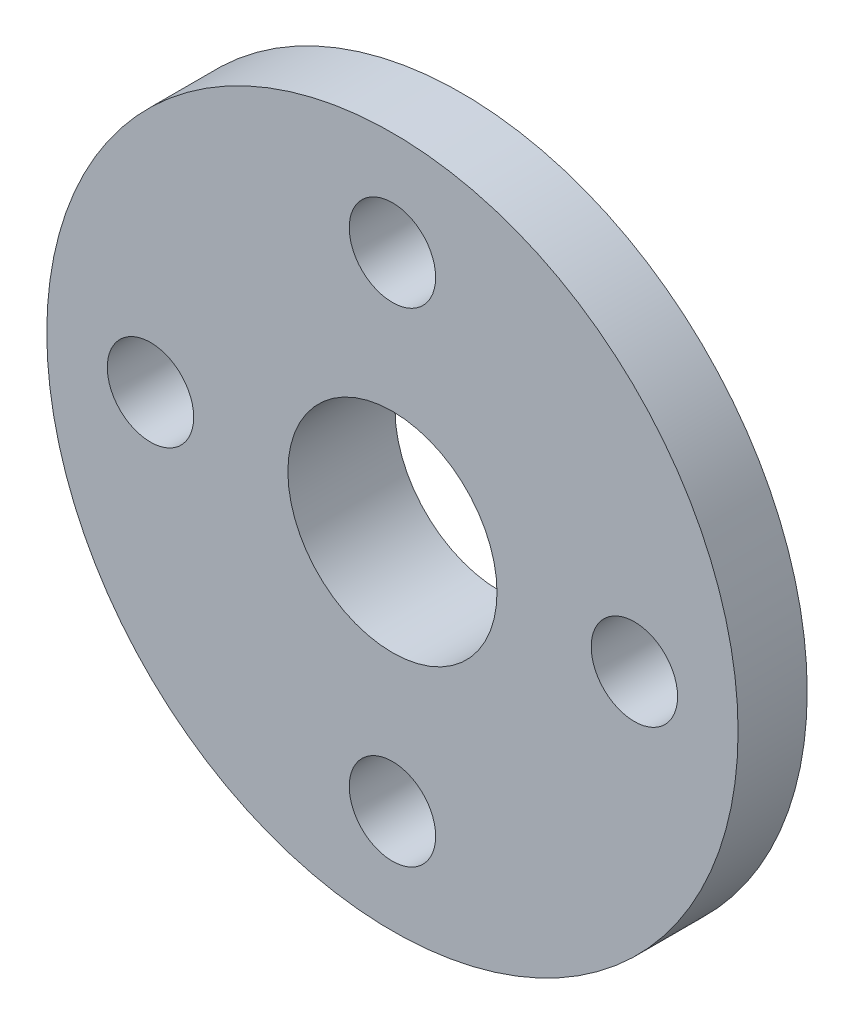
ISO-10303-21;
HEADER;
FILE_DESCRIPTION(('STEP AP214'),'2;1');
FILE_NAME('part.step','',(''),(''),'','','');
FILE_SCHEMA(('AUTOMOTIVE_DESIGN { 1 0 10303 214 1 1 1 1 }'));
ENDSEC;
DATA;
#1=APPLICATION_CONTEXT('core data for automotive mechanical design processes');
#2=APPLICATION_PROTOCOL_DEFINITION('international standard','automotive_design',2000,#1);
#3=PRODUCT_CONTEXT('',#1,'mechanical');
#4=PRODUCT('Part','Part','',(#3));
#5=PRODUCT_RELATED_PRODUCT_CATEGORY('part','',(#4));
#6=PRODUCT_DEFINITION_FORMATION('','',#4);
#7=PRODUCT_DEFINITION_CONTEXT('part definition',#1,'design');
#8=PRODUCT_DEFINITION('design','',#6,#7);
#9=PRODUCT_DEFINITION_SHAPE('','',#8);
#10=(LENGTH_UNIT() NAMED_UNIT(*) SI_UNIT(.MILLI.,.METRE.));
#11=(NAMED_UNIT(*) PLANE_ANGLE_UNIT() SI_UNIT($,.RADIAN.));
#12=(NAMED_UNIT(*) SI_UNIT($,.STERADIAN.) SOLID_ANGLE_UNIT());
#13=UNCERTAINTY_MEASURE_WITH_UNIT(LENGTH_MEASURE(1.E-05),#10,'distance_accuracy_value','');
#14=(GEOMETRIC_REPRESENTATION_CONTEXT(3) GLOBAL_UNCERTAINTY_ASSIGNED_CONTEXT((#13)) GLOBAL_UNIT_ASSIGNED_CONTEXT((#10,
#11,#12)) REPRESENTATION_CONTEXT('',''));
#15=CARTESIAN_POINT('',(0.,0.,0.));
#16=DIRECTION('',(0.,0.,1.));
#17=DIRECTION('',(1.,0.,0.));
#18=AXIS2_PLACEMENT_3D('',#15,#16,#17);
#19=CARTESIAN_POINT('',(-39.10264651977,-19.8999981269,9.476));
#20=DIRECTION('',(0.,0.,1.));
#21=DIRECTION('',(1.,0.,0.));
#22=AXIS2_PLACEMENT_3D('',#19,#20,#21);
#23=CYLINDRICAL_SURFACE('',#22,10.);
#24=CARTESIAN_POINT('',(-39.10264651977,-19.8999981269,9.476));
#25=DIRECTION('',(0.,0.,1.));
#26=DIRECTION('',(1.,0.,0.));
#27=AXIS2_PLACEMENT_3D('',#24,#25,#26);
#28=CIRCLE('',#27,10.);
#29=CARTESIAN_POINT('',(-29.10264651977,-19.8999981269,9.476));
#30=VERTEX_POINT('',#29);
#31=EDGE_CURVE('E36',#30,#30,#28,.T.);
#32=ORIENTED_EDGE('',*,*,#31,.T.);
#33=EDGE_LOOP('',(#32));
#34=FACE_BOUND('',#33,.T.);
#35=CARTESIAN_POINT('',(-39.10264651977,-19.8999981269,11.476));
#36=DIRECTION('',(0.,0.,1.));
#37=DIRECTION('',(1.,0.,0.));
#38=AXIS2_PLACEMENT_3D('',#35,#36,#37);
#39=CIRCLE('',#38,10.);
#40=CARTESIAN_POINT('',(-29.10264651977,-19.8999981269,11.476));
#41=VERTEX_POINT('',#40);
#42=EDGE_CURVE('E46',#41,#41,#39,.T.);
#43=ORIENTED_EDGE('',*,*,#42,.F.);
#44=EDGE_LOOP('',(#43));
#45=FACE_BOUND('',#44,.T.);
#46=ADVANCED_FACE('F34',(#34,#45),#23,.T.);
#47=CARTESIAN_POINT('',(-29.10264651977,-19.8999981269,9.476));
#48=DIRECTION('',(0.,0.,-1.));
#49=DIRECTION('',(-1.,0.,0.));
#50=AXIS2_PLACEMENT_3D('',#47,#48,#49);
#51=PLANE('',#50);
#52=CARTESIAN_POINT('',(-46.10264464667,-19.8999981269,9.476));
#53=DIRECTION('',(0.,0.,-1.));
#54=DIRECTION('',(-1.,0.,0.));
#55=AXIS2_PLACEMENT_3D('',#52,#53,#54);
#56=CIRCLE('',#55,1.24999999999999);
#57=CARTESIAN_POINT('',(-47.35264464667,-19.8999981269,9.476));
#58=VERTEX_POINT('',#57);
#59=EDGE_CURVE('E84',#58,#58,#56,.T.);
#60=ORIENTED_EDGE('',*,*,#59,.F.);
#61=EDGE_LOOP('',(#60));
#62=FACE_BOUND('',#61,.T.);
#63=CARTESIAN_POINT('',(-39.10264651977,-26.8999962538,9.476));
#64=DIRECTION('',(0.,0.,-1.));
#65=DIRECTION('',(-1.,0.,0.));
#66=AXIS2_PLACEMENT_3D('',#63,#64,#65);
#67=CIRCLE('',#66,1.24999999999999);
#68=CARTESIAN_POINT('',(-40.35264651977,-26.8999962538,9.476));
#69=VERTEX_POINT('',#68);
#70=EDGE_CURVE('E76',#69,#69,#67,.T.);
#71=ORIENTED_EDGE('',*,*,#70,.F.);
#72=EDGE_LOOP('',(#71));
#73=FACE_BOUND('',#72,.T.);
#74=CARTESIAN_POINT('',(-32.10264839287,-19.8999981269,9.476));
#75=DIRECTION('',(0.,0.,-1.));
#76=DIRECTION('',(-1.,0.,0.));
#77=AXIS2_PLACEMENT_3D('',#74,#75,#76);
#78=CIRCLE('',#77,1.24999999999999);
#79=CARTESIAN_POINT('',(-33.35264839287,-19.8999981269,9.476));
#80=VERTEX_POINT('',#79);
#81=EDGE_CURVE('E66',#80,#80,#78,.T.);
#82=ORIENTED_EDGE('',*,*,#81,.F.);
#83=EDGE_LOOP('',(#82));
#84=FACE_BOUND('',#83,.T.);
#85=CARTESIAN_POINT('',(-39.10264651977,-12.9,9.476));
#86=DIRECTION('',(0.,0.,-1.));
#87=DIRECTION('',(-1.,0.,0.));
#88=AXIS2_PLACEMENT_3D('',#85,#86,#87);
#89=CIRCLE('',#88,1.24999999999999);
#90=CARTESIAN_POINT('',(-40.35264651977,-12.9,9.476));
#91=VERTEX_POINT('',#90);
#92=EDGE_CURVE('E62',#91,#91,#89,.T.);
#93=ORIENTED_EDGE('',*,*,#92,.F.);
#94=EDGE_LOOP('',(#93));
#95=FACE_BOUND('',#94,.T.);
#96=CARTESIAN_POINT('',(-39.10264651977,-19.8999981269,9.476));
#97=DIRECTION('',(0.,0.,-1.));
#98=DIRECTION('',(-1.,0.,0.));
#99=AXIS2_PLACEMENT_3D('',#96,#97,#98);
#100=CIRCLE('',#99,4.5);
#101=CARTESIAN_POINT('',(-43.60264651977,-19.8999981269,9.476));
#102=VERTEX_POINT('',#101);
#103=EDGE_CURVE('E10',#102,#102,#100,.T.);
#104=ORIENTED_EDGE('',*,*,#103,.F.);
#105=EDGE_LOOP('',(#104));
#106=FACE_BOUND('',#105,.T.);
#107=ORIENTED_EDGE('',*,*,#31,.F.);
#108=EDGE_LOOP('',(#107));
#109=FACE_BOUND('',#108,.T.);
#110=ADVANCED_FACE('F92',(#62,#73,#84,#95,#106,#109),#51,.T.);
#111=CARTESIAN_POINT('',(-39.10264651977,-19.8999981269,11.476));
#112=DIRECTION('',(0.,0.,1.));
#113=DIRECTION('',(1.,0.,0.));
#114=AXIS2_PLACEMENT_3D('',#111,#112,#113);
#115=PLANE('',#114);
#116=CARTESIAN_POINT('',(-46.10264464667,-19.8999981269,11.476));
#117=DIRECTION('',(0.,0.,1.));
#118=DIRECTION('',(1.,0.,0.));
#119=AXIS2_PLACEMENT_3D('',#116,#117,#118);
#120=CIRCLE('',#119,1.24999999999999);
#121=CARTESIAN_POINT('',(-44.85264464667,-19.8999981269,11.476));
#122=VERTEX_POINT('',#121);
#123=EDGE_CURVE('E81',#122,#122,#120,.T.);
#124=ORIENTED_EDGE('',*,*,#123,.F.);
#125=EDGE_LOOP('',(#124));
#126=FACE_BOUND('',#125,.T.);
#127=CARTESIAN_POINT('',(-39.10264651977,-26.8999962538,11.476));
#128=DIRECTION('',(0.,0.,1.));
#129=DIRECTION('',(1.,0.,0.));
#130=AXIS2_PLACEMENT_3D('',#127,#128,#129);
#131=CIRCLE('',#130,1.24999999999999);
#132=CARTESIAN_POINT('',(-37.85264651977,-26.8999962538,11.476));
#133=VERTEX_POINT('',#132);
#134=EDGE_CURVE('E78',#133,#133,#131,.T.);
#135=ORIENTED_EDGE('',*,*,#134,.F.);
#136=EDGE_LOOP('',(#135));
#137=FACE_BOUND('',#136,.T.);
#138=CARTESIAN_POINT('',(-32.10264839287,-19.8999981269,11.476));
#139=DIRECTION('',(0.,0.,1.));
#140=DIRECTION('',(1.,0.,0.));
#141=AXIS2_PLACEMENT_3D('',#138,#139,#140);
#142=CIRCLE('',#141,1.24999999999999);
#143=CARTESIAN_POINT('',(-30.85264839287,-19.8999981269,11.476));
#144=VERTEX_POINT('',#143);
#145=EDGE_CURVE('E71',#144,#144,#142,.T.);
#146=ORIENTED_EDGE('',*,*,#145,.F.);
#147=EDGE_LOOP('',(#146));
#148=FACE_BOUND('',#147,.T.);
#149=CARTESIAN_POINT('',(-39.10264651977,-12.9,11.476));
#150=DIRECTION('',(0.,0.,1.));
#151=DIRECTION('',(1.,0.,0.));
#152=AXIS2_PLACEMENT_3D('',#149,#150,#151);
#153=CIRCLE('',#152,1.24999999999999);
#154=CARTESIAN_POINT('',(-37.85264651977,-12.9,11.476));
#155=VERTEX_POINT('',#154);
#156=EDGE_CURVE('E69',#155,#155,#153,.T.);
#157=ORIENTED_EDGE('',*,*,#156,.F.);
#158=EDGE_LOOP('',(#157));
#159=FACE_BOUND('',#158,.T.);
#160=CARTESIAN_POINT('',(-39.10264651977,-19.8999981269,11.476));
#161=DIRECTION('',(0.,0.,1.));
#162=DIRECTION('',(1.,0.,0.));
#163=AXIS2_PLACEMENT_3D('',#160,#161,#162);
#164=CIRCLE('',#163,3.02500000000001);
#165=CARTESIAN_POINT('',(-36.07764651977,-19.8999981269,11.476));
#166=VERTEX_POINT('',#165);
#167=EDGE_CURVE('E59',#166,#166,#164,.T.);
#168=ORIENTED_EDGE('',*,*,#167,.F.);
#169=EDGE_LOOP('',(#168));
#170=FACE_BOUND('',#169,.T.);
#171=ORIENTED_EDGE('',*,*,#42,.T.);
#172=EDGE_LOOP('',(#171));
#173=FACE_BOUND('',#172,.T.);
#174=ADVANCED_FACE('F93',(#126,#137,#148,#159,#170,#173),#115,.T.);
#175=CARTESIAN_POINT('',(-39.10264651977,-19.8999981269,8.376));
#176=DIRECTION('',(0.,0.,1.));
#177=DIRECTION('',(1.,0.,0.));
#178=AXIS2_PLACEMENT_3D('',#175,#176,#177);
#179=CYLINDRICAL_SURFACE('',#178,4.5);
#180=CARTESIAN_POINT('',(-39.10264651977,-19.8999981269,8.376));
#181=DIRECTION('',(0.,0.,-1.));
#182=DIRECTION('',(-1.,0.,0.));
#183=AXIS2_PLACEMENT_3D('',#180,#181,#182);
#184=CIRCLE('',#183,4.5);
#185=CARTESIAN_POINT('',(-43.60264651977,-19.8999981269,8.376));
#186=VERTEX_POINT('',#185);
#187=EDGE_CURVE('E48',#186,#186,#184,.T.);
#188=ORIENTED_EDGE('',*,*,#187,.F.);
#189=EDGE_LOOP('',(#188));
#190=FACE_BOUND('',#189,.T.);
#191=ORIENTED_EDGE('',*,*,#103,.T.);
#192=EDGE_LOOP('',(#191));
#193=FACE_BOUND('',#192,.T.);
#194=ADVANCED_FACE('F94',(#190,#193),#179,.T.);
#195=CARTESIAN_POINT('',(-39.10264651977,-19.8999981269,8.376));
#196=DIRECTION('',(0.,0.,-1.));
#197=DIRECTION('',(-1.,0.,0.));
#198=AXIS2_PLACEMENT_3D('',#195,#196,#197);
#199=PLANE('',#198);
#200=CARTESIAN_POINT('',(-39.10264651977,-19.8999981269,8.376));
#201=DIRECTION('',(0.,0.,1.));
#202=DIRECTION('',(1.,0.,0.));
#203=AXIS2_PLACEMENT_3D('',#200,#201,#202);
#204=CIRCLE('',#203,3.02500000000001);
#205=CARTESIAN_POINT('',(-36.07764651977,-19.8999981269,8.376));
#206=VERTEX_POINT('',#205);
#207=EDGE_CURVE('E53',#206,#206,#204,.T.);
#208=ORIENTED_EDGE('',*,*,#207,.T.);
#209=EDGE_LOOP('',(#208));
#210=FACE_BOUND('',#209,.T.);
#211=ORIENTED_EDGE('',*,*,#187,.T.);
#212=EDGE_LOOP('',(#211));
#213=FACE_BOUND('',#212,.T.);
#214=ADVANCED_FACE('F107',(#210,#213),#199,.T.);
#215=CARTESIAN_POINT('',(-39.10264651977,-19.8999981269,11.476));
#216=DIRECTION('',(0.,0.,1.));
#217=DIRECTION('',(1.,0.,0.));
#218=AXIS2_PLACEMENT_3D('',#215,#216,#217);
#219=CYLINDRICAL_SURFACE('',#218,3.02500000000001);
#220=ORIENTED_EDGE('',*,*,#207,.F.);
#221=EDGE_LOOP('',(#220));
#222=FACE_BOUND('',#221,.T.);
#223=ORIENTED_EDGE('',*,*,#167,.T.);
#224=EDGE_LOOP('',(#223));
#225=FACE_BOUND('',#224,.T.);
#226=ADVANCED_FACE('F104',(#222,#225),#219,.F.);
#227=CARTESIAN_POINT('',(-39.10264651977,-12.9,11.476));
#228=DIRECTION('',(0.,0.,1.));
#229=DIRECTION('',(1.,0.,0.));
#230=AXIS2_PLACEMENT_3D('',#227,#228,#229);
#231=CYLINDRICAL_SURFACE('',#230,1.24999999999999);
#232=ORIENTED_EDGE('',*,*,#92,.T.);
#233=EDGE_LOOP('',(#232));
#234=FACE_BOUND('',#233,.T.);
#235=ORIENTED_EDGE('',*,*,#156,.T.);
#236=EDGE_LOOP('',(#235));
#237=FACE_BOUND('',#236,.T.);
#238=ADVANCED_FACE('F110',(#234,#237),#231,.F.);
#239=CARTESIAN_POINT('',(-32.10264839287,-19.8999981269,11.476));
#240=DIRECTION('',(0.,0.,1.));
#241=DIRECTION('',(1.,0.,0.));
#242=AXIS2_PLACEMENT_3D('',#239,#240,#241);
#243=CYLINDRICAL_SURFACE('',#242,1.24999999999999);
#244=ORIENTED_EDGE('',*,*,#81,.T.);
#245=EDGE_LOOP('',(#244));
#246=FACE_BOUND('',#245,.T.);
#247=ORIENTED_EDGE('',*,*,#145,.T.);
#248=EDGE_LOOP('',(#247));
#249=FACE_BOUND('',#248,.T.);
#250=ADVANCED_FACE('F116',(#246,#249),#243,.F.);
#251=CARTESIAN_POINT('',(-39.10264651977,-26.8999962538,11.476));
#252=DIRECTION('',(0.,0.,1.));
#253=DIRECTION('',(1.,0.,0.));
#254=AXIS2_PLACEMENT_3D('',#251,#252,#253);
#255=CYLINDRICAL_SURFACE('',#254,1.24999999999999);
#256=ORIENTED_EDGE('',*,*,#70,.T.);
#257=EDGE_LOOP('',(#256));
#258=FACE_BOUND('',#257,.T.);
#259=ORIENTED_EDGE('',*,*,#134,.T.);
#260=EDGE_LOOP('',(#259));
#261=FACE_BOUND('',#260,.T.);
#262=ADVANCED_FACE('F154',(#258,#261),#255,.F.);
#263=CARTESIAN_POINT('',(-46.10264464667,-19.8999981269,11.476));
#264=DIRECTION('',(0.,0.,1.));
#265=DIRECTION('',(1.,0.,0.));
#266=AXIS2_PLACEMENT_3D('',#263,#264,#265);
#267=CYLINDRICAL_SURFACE('',#266,1.24999999999999);
#268=ORIENTED_EDGE('',*,*,#59,.T.);
#269=EDGE_LOOP('',(#268));
#270=FACE_BOUND('',#269,.T.);
#271=ORIENTED_EDGE('',*,*,#123,.T.);
#272=EDGE_LOOP('',(#271));
#273=FACE_BOUND('',#272,.T.);
#274=ADVANCED_FACE('F90',(#270,#273),#267,.F.);
#275=CLOSED_SHELL('',(#46,#110,#174,#194,#214,#226,#238,#250,#262,#274));
#276=MANIFOLD_SOLID_BREP('B2',#275);
#277=ADVANCED_BREP_SHAPE_REPRESENTATION('',(#18,#276),#14);
#278=SHAPE_DEFINITION_REPRESENTATION(#9,#277);
ENDSEC;
END-ISO-10303-21;
